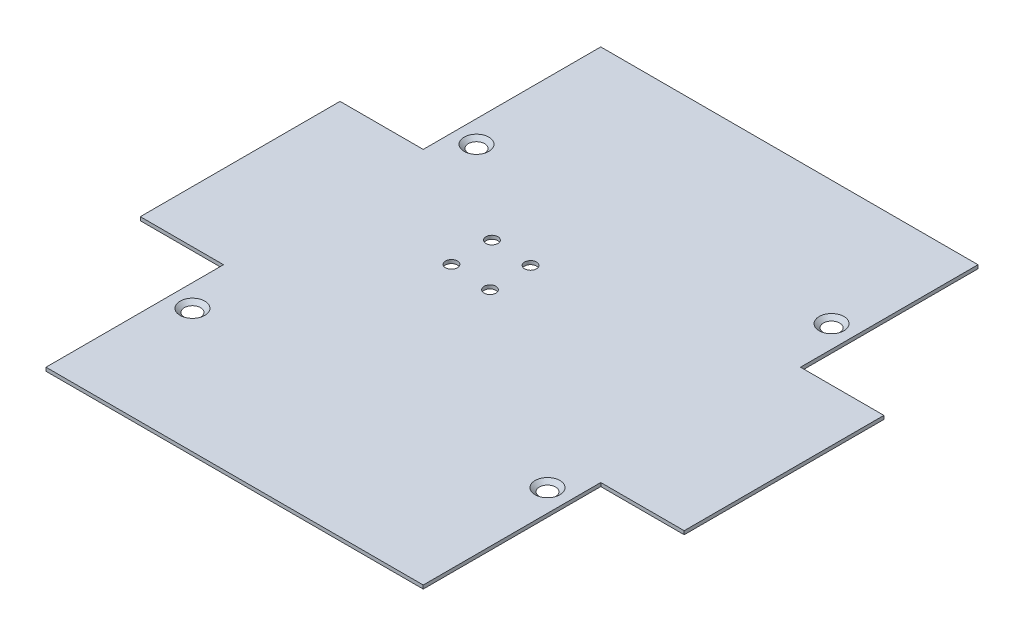
ISO-10303-21;
HEADER;
FILE_DESCRIPTION(('STEP AP214'),'2;1');
FILE_NAME('part.step','',(''),(''),'','','');
FILE_SCHEMA(('AUTOMOTIVE_DESIGN { 1 0 10303 214 1 1 1 1 }'));
ENDSEC;
DATA;
#1=APPLICATION_CONTEXT('core data for automotive mechanical design processes');
#2=APPLICATION_PROTOCOL_DEFINITION('international standard','automotive_design',2000,#1);
#3=PRODUCT_CONTEXT('',#1,'mechanical');
#4=PRODUCT('Part','Part','',(#3));
#5=PRODUCT_RELATED_PRODUCT_CATEGORY('part','',(#4));
#6=PRODUCT_DEFINITION_FORMATION('','',#4);
#7=PRODUCT_DEFINITION_CONTEXT('part definition',#1,'design');
#8=PRODUCT_DEFINITION('design','',#6,#7);
#9=PRODUCT_DEFINITION_SHAPE('','',#8);
#10=(LENGTH_UNIT() NAMED_UNIT(*) SI_UNIT(.MILLI.,.METRE.));
#11=(NAMED_UNIT(*) PLANE_ANGLE_UNIT() SI_UNIT($,.RADIAN.));
#12=(NAMED_UNIT(*) SI_UNIT($,.STERADIAN.) SOLID_ANGLE_UNIT());
#13=UNCERTAINTY_MEASURE_WITH_UNIT(LENGTH_MEASURE(1.E-05),#10,'distance_accuracy_value','');
#14=(GEOMETRIC_REPRESENTATION_CONTEXT(3) GLOBAL_UNCERTAINTY_ASSIGNED_CONTEXT((#13)) GLOBAL_UNIT_ASSIGNED_CONTEXT((#10,
#11,#12)) REPRESENTATION_CONTEXT('',''));
#15=CARTESIAN_POINT('',(0.,0.,0.));
#16=DIRECTION('',(0.,0.,1.));
#17=DIRECTION('',(1.,0.,0.));
#18=AXIS2_PLACEMENT_3D('',#15,#16,#17);
#19=CARTESIAN_POINT('',(0.,1.016,0.));
#20=DIRECTION('',(-1.,0.,0.));
#21=DIRECTION('',(0.,0.,1.));
#22=AXIS2_PLACEMENT_3D('',#19,#20,#21);
#23=PLANE('',#22);
#24=DIRECTION('',(0.,0.,-1.));
#25=VECTOR('',#24,1.);
#26=CARTESIAN_POINT('',(0.,0.,0.));
#27=LINE('',#26,#25);
#28=CARTESIAN_POINT('',(0.,0.,0.));
#29=VERTEX_POINT('',#28);
#30=CARTESIAN_POINT('',(0.,0.,-50.8));
#31=VERTEX_POINT('',#30);
#32=EDGE_CURVE('E156',#29,#31,#27,.T.);
#33=ORIENTED_EDGE('',*,*,#32,.T.);
#34=DIRECTION('',(0.,-1.,0.));
#35=VECTOR('',#34,1.);
#36=CARTESIAN_POINT('',(0.,1.016,-50.8));
#37=LINE('',#36,#35);
#38=CARTESIAN_POINT('',(0.,1.016,-50.8));
#39=VERTEX_POINT('',#38);
#40=EDGE_CURVE('E11',#39,#31,#37,.T.);
#41=ORIENTED_EDGE('',*,*,#40,.F.);
#42=DIRECTION('',(0.,0.,-1.));
#43=VECTOR('',#42,1.);
#44=CARTESIAN_POINT('',(0.,1.016,0.));
#45=LINE('',#44,#43);
#46=CARTESIAN_POINT('',(0.,1.016,0.));
#47=VERTEX_POINT('',#46);
#48=EDGE_CURVE('E179',#47,#39,#45,.T.);
#49=ORIENTED_EDGE('',*,*,#48,.F.);
#50=DIRECTION('',(0.,-1.,0.));
#51=VECTOR('',#50,1.);
#52=CARTESIAN_POINT('',(0.,1.016,0.));
#53=LINE('',#52,#51);
#54=EDGE_CURVE('E152',#47,#29,#53,.T.);
#55=ORIENTED_EDGE('',*,*,#54,.T.);
#56=EDGE_LOOP('',(#33,#41,#49,#55));
#57=FACE_BOUND('',#56,.T.);
#58=ADVANCED_FACE('F34',(#57),#23,.F.);
#59=CARTESIAN_POINT('',(23.876,1.016,-50.8));
#60=DIRECTION('',(0.,0.,-1.));
#61=DIRECTION('',(-1.,0.,0.));
#62=AXIS2_PLACEMENT_3D('',#59,#60,#61);
#63=PLANE('',#62);
#64=DIRECTION('',(1.,0.,0.));
#65=VECTOR('',#64,1.);
#66=CARTESIAN_POINT('',(23.876,0.,-50.8));
#67=LINE('',#66,#65);
#68=CARTESIAN_POINT('',(23.876,0.,-50.8));
#69=VERTEX_POINT('',#68);
#70=EDGE_CURVE('E159',#31,#69,#67,.T.);
#71=ORIENTED_EDGE('',*,*,#70,.T.);
#72=DIRECTION('',(0.,-1.,0.));
#73=VECTOR('',#72,1.);
#74=CARTESIAN_POINT('',(23.876,1.016,-50.8));
#75=LINE('',#74,#73);
#76=CARTESIAN_POINT('',(23.876,1.016,-50.8));
#77=VERTEX_POINT('',#76);
#78=EDGE_CURVE('E43',#77,#69,#75,.T.);
#79=ORIENTED_EDGE('',*,*,#78,.F.);
#80=DIRECTION('',(1.,0.,0.));
#81=VECTOR('',#80,1.);
#82=CARTESIAN_POINT('',(23.876,1.016,-50.8));
#83=LINE('',#82,#81);
#84=EDGE_CURVE('E107',#39,#77,#83,.T.);
#85=ORIENTED_EDGE('',*,*,#84,.F.);
#86=ORIENTED_EDGE('',*,*,#40,.T.);
#87=EDGE_LOOP('',(#71,#79,#85,#86));
#88=FACE_BOUND('',#87,.T.);
#89=ADVANCED_FACE('F293',(#88),#63,.F.);
#90=CARTESIAN_POINT('',(23.876,1.016,-107.95));
#91=DIRECTION('',(-1.,0.,0.));
#92=DIRECTION('',(0.,0.,1.));
#93=AXIS2_PLACEMENT_3D('',#90,#91,#92);
#94=PLANE('',#93);
#95=DIRECTION('',(0.,0.,-1.));
#96=VECTOR('',#95,1.);
#97=CARTESIAN_POINT('',(23.876,0.,-107.95));
#98=LINE('',#97,#96);
#99=CARTESIAN_POINT('',(23.876,0.,-107.95));
#100=VERTEX_POINT('',#99);
#101=EDGE_CURVE('E162',#69,#100,#98,.T.);
#102=ORIENTED_EDGE('',*,*,#101,.T.);
#103=DIRECTION('',(0.,-1.,0.));
#104=VECTOR('',#103,1.);
#105=CARTESIAN_POINT('',(23.876,1.016,-107.95));
#106=LINE('',#105,#104);
#107=CARTESIAN_POINT('',(23.876,1.016,-107.95));
#108=VERTEX_POINT('',#107);
#109=EDGE_CURVE('E198',#108,#100,#106,.T.);
#110=ORIENTED_EDGE('',*,*,#109,.F.);
#111=DIRECTION('',(0.,0.,-1.));
#112=VECTOR('',#111,1.);
#113=CARTESIAN_POINT('',(23.876,1.016,-107.95));
#114=LINE('',#113,#112);
#115=EDGE_CURVE('E252',#77,#108,#114,.T.);
#116=ORIENTED_EDGE('',*,*,#115,.F.);
#117=ORIENTED_EDGE('',*,*,#78,.T.);
#118=EDGE_LOOP('',(#102,#110,#116,#117));
#119=FACE_BOUND('',#118,.T.);
#120=ADVANCED_FACE('F297',(#119),#94,.F.);
#121=CARTESIAN_POINT('',(0.,1.016,-107.95));
#122=DIRECTION('',(0.,0.,1.));
#123=DIRECTION('',(1.,0.,0.));
#124=AXIS2_PLACEMENT_3D('',#121,#122,#123);
#125=PLANE('',#124);
#126=DIRECTION('',(-1.,0.,0.));
#127=VECTOR('',#126,1.);
#128=CARTESIAN_POINT('',(0.,0.,-107.95));
#129=LINE('',#128,#127);
#130=CARTESIAN_POINT('',(0.,0.,-107.95));
#131=VERTEX_POINT('',#130);
#132=EDGE_CURVE('E164',#100,#131,#129,.T.);
#133=ORIENTED_EDGE('',*,*,#132,.T.);
#134=DIRECTION('',(0.,-1.,0.));
#135=VECTOR('',#134,1.);
#136=CARTESIAN_POINT('',(0.,1.016,-107.95));
#137=LINE('',#136,#135);
#138=CARTESIAN_POINT('',(0.,1.016,-107.95));
#139=VERTEX_POINT('',#138);
#140=EDGE_CURVE('E195',#139,#131,#137,.T.);
#141=ORIENTED_EDGE('',*,*,#140,.F.);
#142=DIRECTION('',(-1.,0.,0.));
#143=VECTOR('',#142,1.);
#144=CARTESIAN_POINT('',(0.,1.016,-107.95));
#145=LINE('',#144,#143);
#146=EDGE_CURVE('E254',#108,#139,#145,.T.);
#147=ORIENTED_EDGE('',*,*,#146,.F.);
#148=ORIENTED_EDGE('',*,*,#109,.T.);
#149=EDGE_LOOP('',(#133,#141,#147,#148));
#150=FACE_BOUND('',#149,.T.);
#151=ADVANCED_FACE('F301',(#150),#125,.F.);
#152=CARTESIAN_POINT('',(0.,1.016,-107.95));
#153=DIRECTION('',(-1.,0.,0.));
#154=DIRECTION('',(0.,0.,1.));
#155=AXIS2_PLACEMENT_3D('',#152,#153,#154);
#156=PLANE('',#155);
#157=DIRECTION('',(0.,0.,-1.));
#158=VECTOR('',#157,1.);
#159=CARTESIAN_POINT('',(0.,0.,-107.95));
#160=LINE('',#159,#158);
#161=CARTESIAN_POINT('',(0.,0.,-158.75));
#162=VERTEX_POINT('',#161);
#163=EDGE_CURVE('E166',#131,#162,#160,.T.);
#164=ORIENTED_EDGE('',*,*,#163,.T.);
#165=DIRECTION('',(0.,-1.,0.));
#166=VECTOR('',#165,1.);
#167=CARTESIAN_POINT('',(0.,1.016,-158.75));
#168=LINE('',#167,#166);
#169=CARTESIAN_POINT('',(0.,1.016,-158.75));
#170=VERTEX_POINT('',#169);
#171=EDGE_CURVE('E192',#170,#162,#168,.T.);
#172=ORIENTED_EDGE('',*,*,#171,.F.);
#173=DIRECTION('',(0.,0.,-1.));
#174=VECTOR('',#173,1.);
#175=CARTESIAN_POINT('',(0.,1.016,-107.95));
#176=LINE('',#175,#174);
#177=EDGE_CURVE('E256',#139,#170,#176,.T.);
#178=ORIENTED_EDGE('',*,*,#177,.F.);
#179=ORIENTED_EDGE('',*,*,#140,.T.);
#180=EDGE_LOOP('',(#164,#172,#178,#179));
#181=FACE_BOUND('',#180,.T.);
#182=ADVANCED_FACE('F307',(#181),#156,.F.);
#183=CARTESIAN_POINT('',(0.,1.016,-158.75));
#184=DIRECTION('',(0.,0.,1.));
#185=DIRECTION('',(1.,0.,0.));
#186=AXIS2_PLACEMENT_3D('',#183,#184,#185);
#187=PLANE('',#186);
#188=DIRECTION('',(-1.,0.,0.));
#189=VECTOR('',#188,1.);
#190=CARTESIAN_POINT('',(0.,0.,-158.75));
#191=LINE('',#190,#189);
#192=CARTESIAN_POINT('',(-107.95,0.,-158.75));
#193=VERTEX_POINT('',#192);
#194=EDGE_CURVE('E168',#162,#193,#191,.T.);
#195=ORIENTED_EDGE('',*,*,#194,.T.);
#196=DIRECTION('',(0.,-1.,0.));
#197=VECTOR('',#196,1.);
#198=CARTESIAN_POINT('',(-107.95,1.016,-158.75));
#199=LINE('',#198,#197);
#200=CARTESIAN_POINT('',(-107.95,1.016,-158.75));
#201=VERTEX_POINT('',#200);
#202=EDGE_CURVE('E189',#201,#193,#199,.T.);
#203=ORIENTED_EDGE('',*,*,#202,.F.);
#204=DIRECTION('',(-1.,0.,0.));
#205=VECTOR('',#204,1.);
#206=CARTESIAN_POINT('',(0.,1.016,-158.75));
#207=LINE('',#206,#205);
#208=EDGE_CURVE('E258',#170,#201,#207,.T.);
#209=ORIENTED_EDGE('',*,*,#208,.F.);
#210=ORIENTED_EDGE('',*,*,#171,.T.);
#211=EDGE_LOOP('',(#195,#203,#209,#210));
#212=FACE_BOUND('',#211,.T.);
#213=ADVANCED_FACE('F311',(#212),#187,.F.);
#214=CARTESIAN_POINT('',(-107.95,1.016,-107.95));
#215=DIRECTION('',(1.,0.,0.));
#216=DIRECTION('',(0.,0.,-1.));
#217=AXIS2_PLACEMENT_3D('',#214,#215,#216);
#218=PLANE('',#217);
#219=DIRECTION('',(0.,0.,1.));
#220=VECTOR('',#219,1.);
#221=CARTESIAN_POINT('',(-107.95,0.,-107.95));
#222=LINE('',#221,#220);
#223=CARTESIAN_POINT('',(-107.95,0.,-107.95));
#224=VERTEX_POINT('',#223);
#225=EDGE_CURVE('E170',#193,#224,#222,.T.);
#226=ORIENTED_EDGE('',*,*,#225,.T.);
#227=DIRECTION('',(0.,-1.,0.));
#228=VECTOR('',#227,1.);
#229=CARTESIAN_POINT('',(-107.95,1.016,-107.95));
#230=LINE('',#229,#228);
#231=CARTESIAN_POINT('',(-107.95,1.016,-107.95));
#232=VERTEX_POINT('',#231);
#233=EDGE_CURVE('E186',#232,#224,#230,.T.);
#234=ORIENTED_EDGE('',*,*,#233,.F.);
#235=DIRECTION('',(0.,0.,1.));
#236=VECTOR('',#235,1.);
#237=CARTESIAN_POINT('',(-107.95,1.016,-107.95));
#238=LINE('',#237,#236);
#239=EDGE_CURVE('E260',#201,#232,#238,.T.);
#240=ORIENTED_EDGE('',*,*,#239,.F.);
#241=ORIENTED_EDGE('',*,*,#202,.T.);
#242=EDGE_LOOP('',(#226,#234,#240,#241));
#243=FACE_BOUND('',#242,.T.);
#244=ADVANCED_FACE('F315',(#243),#218,.F.);
#245=CARTESIAN_POINT('',(-131.7625,1.016,-107.95));
#246=DIRECTION('',(0.,0.,1.));
#247=DIRECTION('',(1.,0.,0.));
#248=AXIS2_PLACEMENT_3D('',#245,#246,#247);
#249=PLANE('',#248);
#250=DIRECTION('',(-1.,0.,0.));
#251=VECTOR('',#250,1.);
#252=CARTESIAN_POINT('',(-131.7625,0.,-107.95));
#253=LINE('',#252,#251);
#254=CARTESIAN_POINT('',(-131.7625,0.,-107.95));
#255=VERTEX_POINT('',#254);
#256=EDGE_CURVE('E172',#224,#255,#253,.T.);
#257=ORIENTED_EDGE('',*,*,#256,.T.);
#258=DIRECTION('',(0.,-1.,0.));
#259=VECTOR('',#258,1.);
#260=CARTESIAN_POINT('',(-131.7625,1.016,-107.95));
#261=LINE('',#260,#259);
#262=CARTESIAN_POINT('',(-131.7625,1.016,-107.95));
#263=VERTEX_POINT('',#262);
#264=EDGE_CURVE('E183',#263,#255,#261,.T.);
#265=ORIENTED_EDGE('',*,*,#264,.F.);
#266=DIRECTION('',(-1.,0.,0.));
#267=VECTOR('',#266,1.);
#268=CARTESIAN_POINT('',(-131.7625,1.016,-107.95));
#269=LINE('',#268,#267);
#270=EDGE_CURVE('E262',#232,#263,#269,.T.);
#271=ORIENTED_EDGE('',*,*,#270,.F.);
#272=ORIENTED_EDGE('',*,*,#233,.T.);
#273=EDGE_LOOP('',(#257,#265,#271,#272));
#274=FACE_BOUND('',#273,.T.);
#275=ADVANCED_FACE('F268',(#274),#249,.F.);
#276=CARTESIAN_POINT('',(-131.7625,1.016,-50.8));
#277=DIRECTION('',(1.,0.,0.));
#278=DIRECTION('',(0.,0.,-1.));
#279=AXIS2_PLACEMENT_3D('',#276,#277,#278);
#280=PLANE('',#279);
#281=DIRECTION('',(0.,0.,1.));
#282=VECTOR('',#281,1.);
#283=CARTESIAN_POINT('',(-131.7625,0.,-50.8));
#284=LINE('',#283,#282);
#285=CARTESIAN_POINT('',(-131.7625,0.,-50.8));
#286=VERTEX_POINT('',#285);
#287=EDGE_CURVE('E174',#255,#286,#284,.T.);
#288=ORIENTED_EDGE('',*,*,#287,.T.);
#289=DIRECTION('',(0.,-1.,0.));
#290=VECTOR('',#289,1.);
#291=CARTESIAN_POINT('',(-131.7625,1.016,-50.8));
#292=LINE('',#291,#290);
#293=CARTESIAN_POINT('',(-131.7625,1.016,-50.8));
#294=VERTEX_POINT('',#293);
#295=EDGE_CURVE('E147',#294,#286,#292,.T.);
#296=ORIENTED_EDGE('',*,*,#295,.F.);
#297=DIRECTION('',(0.,0.,1.));
#298=VECTOR('',#297,1.);
#299=CARTESIAN_POINT('',(-131.7625,1.016,-50.8));
#300=LINE('',#299,#298);
#301=EDGE_CURVE('E138',#263,#294,#300,.T.);
#302=ORIENTED_EDGE('',*,*,#301,.F.);
#303=ORIENTED_EDGE('',*,*,#264,.T.);
#304=EDGE_LOOP('',(#288,#296,#302,#303));
#305=FACE_BOUND('',#304,.T.);
#306=ADVANCED_FACE('F272',(#305),#280,.F.);
#307=CARTESIAN_POINT('',(-107.95,1.016,-50.8));
#308=DIRECTION('',(0.,0.,-1.));
#309=DIRECTION('',(-1.,0.,0.));
#310=AXIS2_PLACEMENT_3D('',#307,#308,#309);
#311=PLANE('',#310);
#312=DIRECTION('',(1.,0.,0.));
#313=VECTOR('',#312,1.);
#314=CARTESIAN_POINT('',(-107.95,0.,-50.8));
#315=LINE('',#314,#313);
#316=CARTESIAN_POINT('',(-107.95,0.,-50.8));
#317=VERTEX_POINT('',#316);
#318=EDGE_CURVE('E146',#286,#317,#315,.T.);
#319=ORIENTED_EDGE('',*,*,#318,.T.);
#320=DIRECTION('',(0.,-1.,0.));
#321=VECTOR('',#320,1.);
#322=CARTESIAN_POINT('',(-107.95,1.016,-50.8));
#323=LINE('',#322,#321);
#324=CARTESIAN_POINT('',(-107.95,1.016,-50.8));
#325=VERTEX_POINT('',#324);
#326=EDGE_CURVE('E143',#325,#317,#323,.T.);
#327=ORIENTED_EDGE('',*,*,#326,.F.);
#328=DIRECTION('',(1.,0.,0.));
#329=VECTOR('',#328,1.);
#330=CARTESIAN_POINT('',(-107.95,1.016,-50.8));
#331=LINE('',#330,#329);
#332=EDGE_CURVE('E132',#294,#325,#331,.T.);
#333=ORIENTED_EDGE('',*,*,#332,.F.);
#334=ORIENTED_EDGE('',*,*,#295,.T.);
#335=EDGE_LOOP('',(#319,#327,#333,#334));
#336=FACE_BOUND('',#335,.T.);
#337=ADVANCED_FACE('F144',(#336),#311,.F.);
#338=CARTESIAN_POINT('',(-107.95,1.016,0.));
#339=DIRECTION('',(1.,0.,0.));
#340=DIRECTION('',(0.,0.,-1.));
#341=AXIS2_PLACEMENT_3D('',#338,#339,#340);
#342=PLANE('',#341);
#343=DIRECTION('',(0.,0.,1.));
#344=VECTOR('',#343,1.);
#345=CARTESIAN_POINT('',(-107.95,0.,0.));
#346=LINE('',#345,#344);
#347=CARTESIAN_POINT('',(-107.95,0.,0.));
#348=VERTEX_POINT('',#347);
#349=EDGE_CURVE('E93',#317,#348,#346,.T.);
#350=ORIENTED_EDGE('',*,*,#349,.T.);
#351=DIRECTION('',(0.,-1.,0.));
#352=VECTOR('',#351,1.);
#353=CARTESIAN_POINT('',(-107.95,1.016,0.));
#354=LINE('',#353,#352);
#355=CARTESIAN_POINT('',(-107.95,1.016,0.));
#356=VERTEX_POINT('',#355);
#357=EDGE_CURVE('E148',#356,#348,#354,.T.);
#358=ORIENTED_EDGE('',*,*,#357,.F.);
#359=DIRECTION('',(0.,0.,1.));
#360=VECTOR('',#359,1.);
#361=CARTESIAN_POINT('',(-107.95,1.016,0.));
#362=LINE('',#361,#360);
#363=EDGE_CURVE('E136',#325,#356,#362,.T.);
#364=ORIENTED_EDGE('',*,*,#363,.F.);
#365=ORIENTED_EDGE('',*,*,#326,.T.);
#366=EDGE_LOOP('',(#350,#358,#364,#365));
#367=FACE_BOUND('',#366,.T.);
#368=ADVANCED_FACE('F150',(#367),#342,.F.);
#369=CARTESIAN_POINT('',(0.,1.016,0.));
#370=DIRECTION('',(0.,0.,-1.));
#371=DIRECTION('',(-1.,0.,0.));
#372=AXIS2_PLACEMENT_3D('',#369,#370,#371);
#373=PLANE('',#372);
#374=DIRECTION('',(1.,0.,0.));
#375=VECTOR('',#374,1.);
#376=CARTESIAN_POINT('',(0.,0.,0.));
#377=LINE('',#376,#375);
#378=EDGE_CURVE('E99',#348,#29,#377,.T.);
#379=ORIENTED_EDGE('',*,*,#378,.T.);
#380=ORIENTED_EDGE('',*,*,#54,.F.);
#381=DIRECTION('',(1.,0.,0.));
#382=VECTOR('',#381,1.);
#383=CARTESIAN_POINT('',(0.,1.016,0.));
#384=LINE('',#383,#382);
#385=EDGE_CURVE('E52',#356,#47,#384,.T.);
#386=ORIENTED_EDGE('',*,*,#385,.F.);
#387=ORIENTED_EDGE('',*,*,#357,.T.);
#388=EDGE_LOOP('',(#379,#380,#386,#387));
#389=FACE_BOUND('',#388,.T.);
#390=ADVANCED_FACE('F280',(#389),#373,.F.);
#391=CARTESIAN_POINT('',(0.,1.016,0.));
#392=DIRECTION('',(0.,1.,0.));
#393=DIRECTION('',(0.,0.,1.));
#394=AXIS2_PLACEMENT_3D('',#391,#392,#393);
#395=PLANE('',#394);
#396=CARTESIAN_POINT('',(-63.8469868311595,1.016,-94.5485004069771));
#397=DIRECTION('',(0.,1.,0.));
#398=DIRECTION('',(0.,0.,1.));
#399=AXIS2_PLACEMENT_3D('',#396,#397,#398);
#400=CIRCLE('',#399,1.69999999999999);
#401=CARTESIAN_POINT('',(-63.8469868311595,1.016,-92.8485004069771));
#402=VERTEX_POINT('',#401);
#403=EDGE_CURVE('E237',#402,#402,#400,.T.);
#404=ORIENTED_EDGE('',*,*,#403,.F.);
#405=EDGE_LOOP('',(#404));
#406=FACE_BOUND('',#405,.T.);
#407=CARTESIAN_POINT('',(-63.6211715853699,1.016,-82.7316053127838));
#408=DIRECTION('',(0.,1.,0.));
#409=DIRECTION('',(0.,0.,1.));
#410=AXIS2_PLACEMENT_3D('',#407,#408,#409);
#411=CIRCLE('',#410,1.69999999999999);
#412=CARTESIAN_POINT('',(-63.6211715853699,1.016,-81.0316053127839));
#413=VERTEX_POINT('',#412);
#414=EDGE_CURVE('E227',#413,#413,#411,.T.);
#415=ORIENTED_EDGE('',*,*,#414,.F.);
#416=EDGE_LOOP('',(#415));
#417=FACE_BOUND('',#416,.T.);
#418=CARTESIAN_POINT('',(-75.6413284146301,1.016,-95.3123778872162));
#419=DIRECTION('',(0.,1.,0.));
#420=DIRECTION('',(0.,0.,1.));
#421=AXIS2_PLACEMENT_3D('',#418,#419,#420);
#422=CIRCLE('',#421,1.69999999999999);
#423=CARTESIAN_POINT('',(-75.6413284146301,1.016,-93.6123778872163));
#424=VERTEX_POINT('',#423);
#425=EDGE_CURVE('E224',#424,#424,#422,.T.);
#426=ORIENTED_EDGE('',*,*,#425,.F.);
#427=EDGE_LOOP('',(#426));
#428=FACE_BOUND('',#427,.T.);
#429=CARTESIAN_POINT('',(-75.4155131688405,1.016,-83.495482793023));
#430=DIRECTION('',(0.,1.,0.));
#431=DIRECTION('',(0.,0.,1.));
#432=AXIS2_PLACEMENT_3D('',#429,#430,#431);
#433=CIRCLE('',#432,1.69999999999999);
#434=CARTESIAN_POINT('',(-75.4155131688405,1.016,-81.795482793023));
#435=VERTEX_POINT('',#434);
#436=EDGE_CURVE('E221',#435,#435,#433,.T.);
#437=ORIENTED_EDGE('',*,*,#436,.F.);
#438=EDGE_LOOP('',(#437));
#439=FACE_BOUND('',#438,.T.);
#440=CARTESIAN_POINT('',(-101.6,1.016,-116.84));
#441=DIRECTION('',(0.,1.,0.));
#442=DIRECTION('',(0.,0.,1.));
#443=AXIS2_PLACEMENT_3D('',#440,#441,#442);
#444=CIRCLE('',#443,3.5433);
#445=CARTESIAN_POINT('',(-101.6,1.016,-113.2967));
#446=VERTEX_POINT('',#445);
#447=EDGE_CURVE('E217',#446,#446,#444,.T.);
#448=ORIENTED_EDGE('',*,*,#447,.F.);
#449=EDGE_LOOP('',(#448));
#450=FACE_BOUND('',#449,.T.);
#451=CARTESIAN_POINT('',(-6.35,1.016,-123.19));
#452=DIRECTION('',(0.,1.,0.));
#453=DIRECTION('',(0.,0.,1.));
#454=AXIS2_PLACEMENT_3D('',#451,#452,#453);
#455=CIRCLE('',#454,3.5433);
#456=CARTESIAN_POINT('',(-6.35,1.016,-119.6467));
#457=VERTEX_POINT('',#456);
#458=EDGE_CURVE('E213',#457,#457,#455,.T.);
#459=ORIENTED_EDGE('',*,*,#458,.F.);
#460=EDGE_LOOP('',(#459));
#461=FACE_BOUND('',#460,.T.);
#462=CARTESIAN_POINT('',(-6.34999999999999,1.016,-41.91));
#463=DIRECTION('',(0.,1.,0.));
#464=DIRECTION('',(0.,0.,1.));
#465=AXIS2_PLACEMENT_3D('',#462,#463,#464);
#466=CIRCLE('',#465,3.5433);
#467=CARTESIAN_POINT('',(-6.34999999999999,1.016,-38.3667));
#468=VERTEX_POINT('',#467);
#469=EDGE_CURVE('E209',#468,#468,#466,.T.);
#470=ORIENTED_EDGE('',*,*,#469,.F.);
#471=EDGE_LOOP('',(#470));
#472=FACE_BOUND('',#471,.T.);
#473=CARTESIAN_POINT('',(-101.6,1.016,-35.56));
#474=DIRECTION('',(0.,1.,0.));
#475=DIRECTION('',(0.,0.,1.));
#476=AXIS2_PLACEMENT_3D('',#473,#474,#475);
#477=CIRCLE('',#476,3.5433);
#478=CARTESIAN_POINT('',(-101.6,1.016,-32.0167));
#479=VERTEX_POINT('',#478);
#480=EDGE_CURVE('E205',#479,#479,#477,.T.);
#481=ORIENTED_EDGE('',*,*,#480,.F.);
#482=EDGE_LOOP('',(#481));
#483=FACE_BOUND('',#482,.T.);
#484=ORIENTED_EDGE('',*,*,#48,.T.);
#485=ORIENTED_EDGE('',*,*,#84,.T.);
#486=ORIENTED_EDGE('',*,*,#115,.T.);
#487=ORIENTED_EDGE('',*,*,#146,.T.);
#488=ORIENTED_EDGE('',*,*,#177,.T.);
#489=ORIENTED_EDGE('',*,*,#208,.T.);
#490=ORIENTED_EDGE('',*,*,#239,.T.);
#491=ORIENTED_EDGE('',*,*,#270,.T.);
#492=ORIENTED_EDGE('',*,*,#301,.T.);
#493=ORIENTED_EDGE('',*,*,#332,.T.);
#494=ORIENTED_EDGE('',*,*,#363,.T.);
#495=ORIENTED_EDGE('',*,*,#385,.T.);
#496=EDGE_LOOP('',(#484,#485,#486,#487,#488,#489,#490,#491,#492,#493,#494,#495));
#497=FACE_BOUND('',#496,.T.);
#498=ADVANCED_FACE('F134',(#406,#417,#428,#439,#450,#461,#472,#483,#497),#395,.T.);
#499=CARTESIAN_POINT('',(0.,0.,0.));
#500=DIRECTION('',(0.,1.,0.));
#501=DIRECTION('',(0.,0.,1.));
#502=AXIS2_PLACEMENT_3D('',#499,#500,#501);
#503=PLANE('',#502);
#504=CARTESIAN_POINT('',(-63.8469868311595,0.,-94.5485004069771));
#505=DIRECTION('',(0.,1.,0.));
#506=DIRECTION('',(0.,0.,1.));
#507=AXIS2_PLACEMENT_3D('',#504,#505,#506);
#508=CIRCLE('',#507,1.69999999999999);
#509=CARTESIAN_POINT('',(-63.8469868311595,0.,-92.8485004069771));
#510=VERTEX_POINT('',#509);
#511=EDGE_CURVE('E37',#510,#510,#508,.T.);
#512=ORIENTED_EDGE('',*,*,#511,.T.);
#513=EDGE_LOOP('',(#512));
#514=FACE_BOUND('',#513,.T.);
#515=CARTESIAN_POINT('',(-63.6211715853699,0.,-82.7316053127838));
#516=DIRECTION('',(0.,1.,0.));
#517=DIRECTION('',(0.,0.,1.));
#518=AXIS2_PLACEMENT_3D('',#515,#516,#517);
#519=CIRCLE('',#518,1.69999999999999);
#520=CARTESIAN_POINT('',(-63.6211715853699,0.,-81.0316053127839));
#521=VERTEX_POINT('',#520);
#522=EDGE_CURVE('E225',#521,#521,#519,.T.);
#523=ORIENTED_EDGE('',*,*,#522,.T.);
#524=EDGE_LOOP('',(#523));
#525=FACE_BOUND('',#524,.T.);
#526=CARTESIAN_POINT('',(-75.6413284146301,0.,-95.3123778872162));
#527=DIRECTION('',(0.,1.,0.));
#528=DIRECTION('',(0.,0.,1.));
#529=AXIS2_PLACEMENT_3D('',#526,#527,#528);
#530=CIRCLE('',#529,1.69999999999999);
#531=CARTESIAN_POINT('',(-75.6413284146301,0.,-93.6123778872163));
#532=VERTEX_POINT('',#531);
#533=EDGE_CURVE('E222',#532,#532,#530,.T.);
#534=ORIENTED_EDGE('',*,*,#533,.T.);
#535=EDGE_LOOP('',(#534));
#536=FACE_BOUND('',#535,.T.);
#537=CARTESIAN_POINT('',(-75.4155131688405,0.,-83.495482793023));
#538=DIRECTION('',(0.,1.,0.));
#539=DIRECTION('',(0.,0.,1.));
#540=AXIS2_PLACEMENT_3D('',#537,#538,#539);
#541=CIRCLE('',#540,1.69999999999999);
#542=CARTESIAN_POINT('',(-75.4155131688405,0.,-81.795482793023));
#543=VERTEX_POINT('',#542);
#544=EDGE_CURVE('E218',#543,#543,#541,.T.);
#545=ORIENTED_EDGE('',*,*,#544,.T.);
#546=EDGE_LOOP('',(#545));
#547=FACE_BOUND('',#546,.T.);
#548=CARTESIAN_POINT('',(-101.6,0.,-116.84));
#549=DIRECTION('',(0.,1.,0.));
#550=DIRECTION('',(0.,0.,1.));
#551=AXIS2_PLACEMENT_3D('',#548,#549,#550);
#552=CIRCLE('',#551,2.33247834992428);
#553=CARTESIAN_POINT('',(-101.6,0.,-114.507521650076));
#554=VERTEX_POINT('',#553);
#555=EDGE_CURVE('E214',#554,#554,#552,.T.);
#556=ORIENTED_EDGE('',*,*,#555,.T.);
#557=EDGE_LOOP('',(#556));
#558=FACE_BOUND('',#557,.T.);
#559=CARTESIAN_POINT('',(-6.35,0.,-123.19));
#560=DIRECTION('',(0.,1.,0.));
#561=DIRECTION('',(0.,0.,1.));
#562=AXIS2_PLACEMENT_3D('',#559,#560,#561);
#563=CIRCLE('',#562,2.33247834992428);
#564=CARTESIAN_POINT('',(-6.35,0.,-120.857521650076));
#565=VERTEX_POINT('',#564);
#566=EDGE_CURVE('E210',#565,#565,#563,.T.);
#567=ORIENTED_EDGE('',*,*,#566,.T.);
#568=EDGE_LOOP('',(#567));
#569=FACE_BOUND('',#568,.T.);
#570=CARTESIAN_POINT('',(-6.34999999999999,0.,-41.91));
#571=DIRECTION('',(0.,1.,0.));
#572=DIRECTION('',(0.,0.,1.));
#573=AXIS2_PLACEMENT_3D('',#570,#571,#572);
#574=CIRCLE('',#573,2.33247834992428);
#575=CARTESIAN_POINT('',(-6.34999999999999,0.,-39.5775216500757));
#576=VERTEX_POINT('',#575);
#577=EDGE_CURVE('E206',#576,#576,#574,.T.);
#578=ORIENTED_EDGE('',*,*,#577,.T.);
#579=EDGE_LOOP('',(#578));
#580=FACE_BOUND('',#579,.T.);
#581=CARTESIAN_POINT('',(-101.6,0.,-35.56));
#582=DIRECTION('',(0.,1.,0.));
#583=DIRECTION('',(0.,0.,1.));
#584=AXIS2_PLACEMENT_3D('',#581,#582,#583);
#585=CIRCLE('',#584,2.33247834992428);
#586=CARTESIAN_POINT('',(-101.6,0.,-33.2275216500757));
#587=VERTEX_POINT('',#586);
#588=EDGE_CURVE('E160',#587,#587,#585,.T.);
#589=ORIENTED_EDGE('',*,*,#588,.T.);
#590=EDGE_LOOP('',(#589));
#591=FACE_BOUND('',#590,.T.);
#592=ORIENTED_EDGE('',*,*,#32,.F.);
#593=ORIENTED_EDGE('',*,*,#378,.F.);
#594=ORIENTED_EDGE('',*,*,#349,.F.);
#595=ORIENTED_EDGE('',*,*,#318,.F.);
#596=ORIENTED_EDGE('',*,*,#287,.F.);
#597=ORIENTED_EDGE('',*,*,#256,.F.);
#598=ORIENTED_EDGE('',*,*,#225,.F.);
#599=ORIENTED_EDGE('',*,*,#194,.F.);
#600=ORIENTED_EDGE('',*,*,#163,.F.);
#601=ORIENTED_EDGE('',*,*,#132,.F.);
#602=ORIENTED_EDGE('',*,*,#101,.F.);
#603=ORIENTED_EDGE('',*,*,#70,.F.);
#604=EDGE_LOOP('',(#592,#593,#594,#595,#596,#597,#598,#599,#600,#601,#602,#603));
#605=FACE_BOUND('',#604,.T.);
#606=ADVANCED_FACE('F275',(#514,#525,#536,#547,#558,#569,#580,#591,#605),#503,.F.);
#607=CARTESIAN_POINT('',(-101.6,1.016,-35.56));
#608=DIRECTION('',(0.,1.,0.));
#609=DIRECTION('',(0.,0.,1.));
#610=AXIS2_PLACEMENT_3D('',#607,#608,#609);
#611=CONICAL_SURFACE('',#610,3.5433,0.872664625997164);
#612=ORIENTED_EDGE('',*,*,#480,.T.);
#613=EDGE_LOOP('',(#612));
#614=FACE_BOUND('',#613,.T.);
#615=ORIENTED_EDGE('',*,*,#588,.F.);
#616=EDGE_LOOP('',(#615));
#617=FACE_BOUND('',#616,.T.);
#618=ADVANCED_FACE('F343',(#614,#617),#611,.F.);
#619=CARTESIAN_POINT('',(-6.34999999999999,1.016,-41.91));
#620=DIRECTION('',(0.,1.,0.));
#621=DIRECTION('',(0.,0.,1.));
#622=AXIS2_PLACEMENT_3D('',#619,#620,#621);
#623=CONICAL_SURFACE('',#622,3.5433,0.872664625997165);
#624=ORIENTED_EDGE('',*,*,#469,.T.);
#625=EDGE_LOOP('',(#624));
#626=FACE_BOUND('',#625,.T.);
#627=ORIENTED_EDGE('',*,*,#577,.F.);
#628=EDGE_LOOP('',(#627));
#629=FACE_BOUND('',#628,.T.);
#630=ADVANCED_FACE('F348',(#626,#629),#623,.F.);
#631=CARTESIAN_POINT('',(-6.35,1.016,-123.19));
#632=DIRECTION('',(0.,1.,0.));
#633=DIRECTION('',(0.,0.,1.));
#634=AXIS2_PLACEMENT_3D('',#631,#632,#633);
#635=CONICAL_SURFACE('',#634,3.5433,0.872664625997165);
#636=ORIENTED_EDGE('',*,*,#458,.T.);
#637=EDGE_LOOP('',(#636));
#638=FACE_BOUND('',#637,.T.);
#639=ORIENTED_EDGE('',*,*,#566,.F.);
#640=EDGE_LOOP('',(#639));
#641=FACE_BOUND('',#640,.T.);
#642=ADVANCED_FACE('F360',(#638,#641),#635,.F.);
#643=CARTESIAN_POINT('',(-101.6,1.016,-116.84));
#644=DIRECTION('',(0.,1.,0.));
#645=DIRECTION('',(0.,0.,1.));
#646=AXIS2_PLACEMENT_3D('',#643,#644,#645);
#647=CONICAL_SURFACE('',#646,3.5433,0.872664625997164);
#648=ORIENTED_EDGE('',*,*,#447,.T.);
#649=EDGE_LOOP('',(#648));
#650=FACE_BOUND('',#649,.T.);
#651=ORIENTED_EDGE('',*,*,#555,.F.);
#652=EDGE_LOOP('',(#651));
#653=FACE_BOUND('',#652,.T.);
#654=ADVANCED_FACE('F370',(#650,#653),#647,.F.);
#655=CARTESIAN_POINT('',(-75.4155131688405,1.016,-83.495482793023));
#656=DIRECTION('',(0.,1.,0.));
#657=DIRECTION('',(0.,0.,1.));
#658=AXIS2_PLACEMENT_3D('',#655,#656,#657);
#659=CYLINDRICAL_SURFACE('',#658,1.69999999999999);
#660=ORIENTED_EDGE('',*,*,#436,.T.);
#661=EDGE_LOOP('',(#660));
#662=FACE_BOUND('',#661,.T.);
#663=ORIENTED_EDGE('',*,*,#544,.F.);
#664=EDGE_LOOP('',(#663));
#665=FACE_BOUND('',#664,.T.);
#666=ADVANCED_FACE('F379',(#662,#665),#659,.F.);
#667=CARTESIAN_POINT('',(-75.6413284146301,1.016,-95.3123778872162));
#668=DIRECTION('',(0.,1.,0.));
#669=DIRECTION('',(0.,0.,1.));
#670=AXIS2_PLACEMENT_3D('',#667,#668,#669);
#671=CYLINDRICAL_SURFACE('',#670,1.69999999999999);
#672=ORIENTED_EDGE('',*,*,#425,.T.);
#673=EDGE_LOOP('',(#672));
#674=FACE_BOUND('',#673,.T.);
#675=ORIENTED_EDGE('',*,*,#533,.F.);
#676=EDGE_LOOP('',(#675));
#677=FACE_BOUND('',#676,.T.);
#678=ADVANCED_FACE('F396',(#674,#677),#671,.F.);
#679=CARTESIAN_POINT('',(-63.6211715853699,1.016,-82.7316053127838));
#680=DIRECTION('',(0.,1.,0.));
#681=DIRECTION('',(0.,0.,1.));
#682=AXIS2_PLACEMENT_3D('',#679,#680,#681);
#683=CYLINDRICAL_SURFACE('',#682,1.69999999999999);
#684=ORIENTED_EDGE('',*,*,#414,.T.);
#685=EDGE_LOOP('',(#684));
#686=FACE_BOUND('',#685,.T.);
#687=ORIENTED_EDGE('',*,*,#522,.F.);
#688=EDGE_LOOP('',(#687));
#689=FACE_BOUND('',#688,.T.);
#690=ADVANCED_FACE('F406',(#686,#689),#683,.F.);
#691=CARTESIAN_POINT('',(-63.8469868311595,1.016,-94.5485004069771));
#692=DIRECTION('',(0.,1.,0.));
#693=DIRECTION('',(0.,0.,1.));
#694=AXIS2_PLACEMENT_3D('',#691,#692,#693);
#695=CYLINDRICAL_SURFACE('',#694,1.69999999999999);
#696=ORIENTED_EDGE('',*,*,#403,.T.);
#697=EDGE_LOOP('',(#696));
#698=FACE_BOUND('',#697,.T.);
#699=ORIENTED_EDGE('',*,*,#511,.F.);
#700=EDGE_LOOP('',(#699));
#701=FACE_BOUND('',#700,.T.);
#702=ADVANCED_FACE('F416',(#698,#701),#695,.F.);
#703=CLOSED_SHELL('',(#58,#89,#120,#151,#182,#213,#244,#275,#306,#337,#368,#390,#498,#606,#618,
#630,#642,#654,#666,#678,#690,#702));
#704=MANIFOLD_SOLID_BREP('B2',#703);
#705=ADVANCED_BREP_SHAPE_REPRESENTATION('',(#18,#704),#14);
#706=SHAPE_DEFINITION_REPRESENTATION(#9,#705);
ENDSEC;
END-ISO-10303-21;
